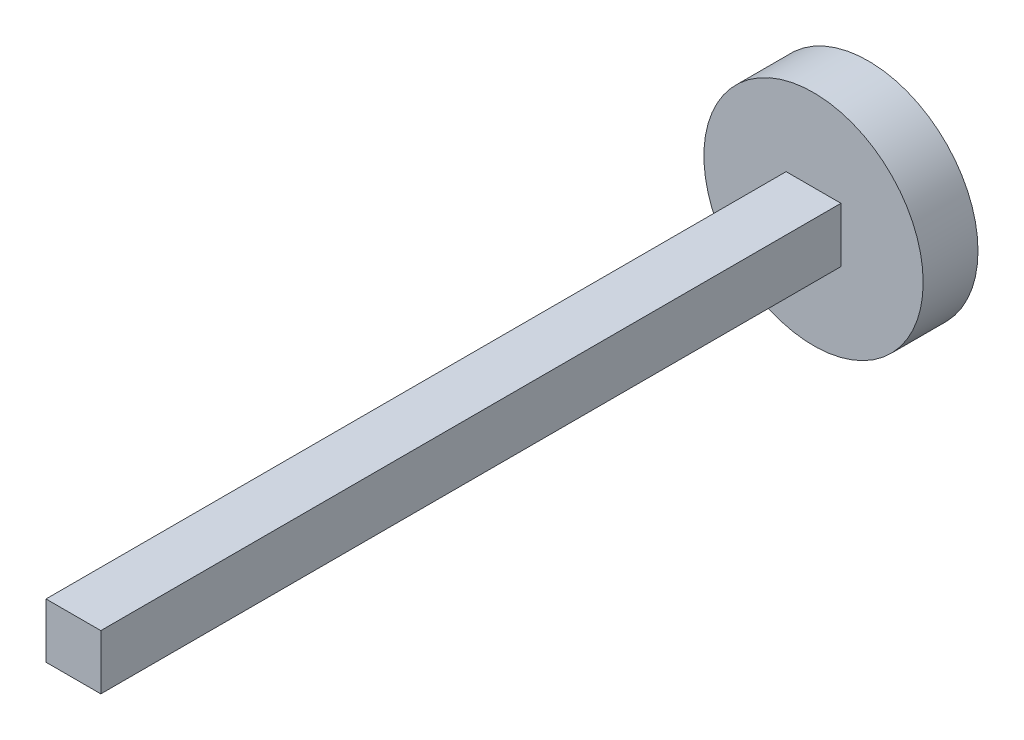
ISO-10303-21;
HEADER;
FILE_DESCRIPTION(('STEP AP214'),'2;1');
FILE_NAME('part.step','',(''),(''),'','','');
FILE_SCHEMA(('AUTOMOTIVE_DESIGN { 1 0 10303 214 1 1 1 1 }'));
ENDSEC;
DATA;
#1=APPLICATION_CONTEXT('core data for automotive mechanical design processes');
#2=APPLICATION_PROTOCOL_DEFINITION('international standard','automotive_design',2000,#1);
#3=PRODUCT_CONTEXT('',#1,'mechanical');
#4=PRODUCT('Part','Part','',(#3));
#5=PRODUCT_RELATED_PRODUCT_CATEGORY('part','',(#4));
#6=PRODUCT_DEFINITION_FORMATION('','',#4);
#7=PRODUCT_DEFINITION_CONTEXT('part definition',#1,'design');
#8=PRODUCT_DEFINITION('design','',#6,#7);
#9=PRODUCT_DEFINITION_SHAPE('','',#8);
#10=(LENGTH_UNIT() NAMED_UNIT(*) SI_UNIT(.MILLI.,.METRE.));
#11=(NAMED_UNIT(*) PLANE_ANGLE_UNIT() SI_UNIT($,.RADIAN.));
#12=(NAMED_UNIT(*) SI_UNIT($,.STERADIAN.) SOLID_ANGLE_UNIT());
#13=UNCERTAINTY_MEASURE_WITH_UNIT(LENGTH_MEASURE(1.E-05),#10,'distance_accuracy_value','');
#14=(GEOMETRIC_REPRESENTATION_CONTEXT(3) GLOBAL_UNCERTAINTY_ASSIGNED_CONTEXT((#13)) GLOBAL_UNIT_ASSIGNED_CONTEXT((#10,
#11,#12)) REPRESENTATION_CONTEXT('',''));
#15=CARTESIAN_POINT('',(0.,0.,0.));
#16=DIRECTION('',(0.,0.,1.));
#17=DIRECTION('',(1.,0.,0.));
#18=AXIS2_PLACEMENT_3D('',#15,#16,#17);
#19=CARTESIAN_POINT('',(0.,0.,20.));
#20=DIRECTION('',(0.,0.,-1.));
#21=DIRECTION('',(-1.,0.,0.));
#22=AXIS2_PLACEMENT_3D('',#19,#20,#21);
#23=CYLINDRICAL_SURFACE('',#22,40.);
#24=CARTESIAN_POINT('',(0.,0.,20.));
#25=DIRECTION('',(0.,0.,1.));
#26=DIRECTION('',(1.,0.,0.));
#27=AXIS2_PLACEMENT_3D('',#24,#25,#26);
#28=CIRCLE('',#27,40.);
#29=CARTESIAN_POINT('',(40.,0.,20.));
#30=VERTEX_POINT('',#29);
#31=EDGE_CURVE('E11',#30,#30,#28,.T.);
#32=ORIENTED_EDGE('',*,*,#31,.F.);
#33=EDGE_LOOP('',(#32));
#34=FACE_BOUND('',#33,.T.);
#35=CARTESIAN_POINT('',(0.,0.,0.));
#36=DIRECTION('',(0.,0.,1.));
#37=DIRECTION('',(1.,0.,0.));
#38=AXIS2_PLACEMENT_3D('',#35,#36,#37);
#39=CIRCLE('',#38,40.);
#40=CARTESIAN_POINT('',(40.,0.,0.));
#41=VERTEX_POINT('',#40);
#42=EDGE_CURVE('E42',#41,#41,#39,.T.);
#43=ORIENTED_EDGE('',*,*,#42,.T.);
#44=EDGE_LOOP('',(#43));
#45=FACE_BOUND('',#44,.T.);
#46=ADVANCED_FACE('F39',(#34,#45),#23,.T.);
#47=CARTESIAN_POINT('',(0.,0.,20.));
#48=DIRECTION('',(0.,0.,1.));
#49=DIRECTION('',(1.,0.,0.));
#50=AXIS2_PLACEMENT_3D('',#47,#48,#49);
#51=PLANE('',#50);
#52=DIRECTION('',(0.,1.,0.));
#53=VECTOR('',#52,1.);
#54=CARTESIAN_POINT('',(10.,-10.,20.));
#55=LINE('',#54,#53);
#56=CARTESIAN_POINT('',(10.,-10.,20.));
#57=VERTEX_POINT('',#56);
#58=CARTESIAN_POINT('',(10.,10.,20.));
#59=VERTEX_POINT('',#58);
#60=EDGE_CURVE('E54',#57,#59,#55,.T.);
#61=ORIENTED_EDGE('',*,*,#60,.F.);
#62=DIRECTION('',(1.,0.,0.));
#63=VECTOR('',#62,1.);
#64=CARTESIAN_POINT('',(-10.,-10.,20.));
#65=LINE('',#64,#63);
#66=CARTESIAN_POINT('',(-10.,-10.,20.));
#67=VERTEX_POINT('',#66);
#68=EDGE_CURVE('E58',#67,#57,#65,.T.);
#69=ORIENTED_EDGE('',*,*,#68,.F.);
#70=DIRECTION('',(0.,-1.,0.));
#71=VECTOR('',#70,1.);
#72=CARTESIAN_POINT('',(-10.,-10.,20.));
#73=LINE('',#72,#71);
#74=CARTESIAN_POINT('',(-10.,10.,20.));
#75=VERTEX_POINT('',#74);
#76=EDGE_CURVE('E118',#75,#67,#73,.T.);
#77=ORIENTED_EDGE('',*,*,#76,.F.);
#78=DIRECTION('',(-1.,0.,0.));
#79=VECTOR('',#78,1.);
#80=CARTESIAN_POINT('',(-10.,10.,20.));
#81=LINE('',#80,#79);
#82=EDGE_CURVE('E121',#59,#75,#81,.T.);
#83=ORIENTED_EDGE('',*,*,#82,.F.);
#84=EDGE_LOOP('',(#61,#69,#77,#83));
#85=FACE_BOUND('',#84,.T.);
#86=ORIENTED_EDGE('',*,*,#31,.T.);
#87=EDGE_LOOP('',(#86));
#88=FACE_BOUND('',#87,.T.);
#89=ADVANCED_FACE('F143',(#85,#88),#51,.T.);
#90=CARTESIAN_POINT('',(0.,0.,0.));
#91=DIRECTION('',(0.,0.,1.));
#92=DIRECTION('',(1.,0.,0.));
#93=AXIS2_PLACEMENT_3D('',#90,#91,#92);
#94=PLANE('',#93);
#95=ORIENTED_EDGE('',*,*,#42,.F.);
#96=EDGE_LOOP('',(#95));
#97=FACE_BOUND('',#96,.T.);
#98=ADVANCED_FACE('F148',(#97),#94,.F.);
#99=CARTESIAN_POINT('',(10.,-10.,290.));
#100=DIRECTION('',(-1.,0.,0.));
#101=DIRECTION('',(0.,0.,1.));
#102=AXIS2_PLACEMENT_3D('',#99,#100,#101);
#103=PLANE('',#102);
#104=ORIENTED_EDGE('',*,*,#60,.T.);
#105=DIRECTION('',(0.,0.,-1.));
#106=VECTOR('',#105,1.);
#107=CARTESIAN_POINT('',(10.,10.,290.));
#108=LINE('',#107,#106);
#109=CARTESIAN_POINT('',(10.,10.,290.));
#110=VERTEX_POINT('',#109);
#111=EDGE_CURVE('E83',#110,#59,#108,.T.);
#112=ORIENTED_EDGE('',*,*,#111,.F.);
#113=DIRECTION('',(0.,1.,0.));
#114=VECTOR('',#113,1.);
#115=CARTESIAN_POINT('',(10.,-10.,290.));
#116=LINE('',#115,#114);
#117=CARTESIAN_POINT('',(10.,-10.,290.));
#118=VERTEX_POINT('',#117);
#119=EDGE_CURVE('E90',#118,#110,#116,.T.);
#120=ORIENTED_EDGE('',*,*,#119,.F.);
#121=DIRECTION('',(0.,0.,-1.));
#122=VECTOR('',#121,1.);
#123=CARTESIAN_POINT('',(10.,-10.,290.));
#124=LINE('',#123,#122);
#125=EDGE_CURVE('E113',#118,#57,#124,.T.);
#126=ORIENTED_EDGE('',*,*,#125,.T.);
#127=EDGE_LOOP('',(#104,#112,#120,#126));
#128=FACE_BOUND('',#127,.T.);
#129=ADVANCED_FACE('F101',(#128),#103,.F.);
#130=CARTESIAN_POINT('',(-10.,10.,290.));
#131=DIRECTION('',(0.,-1.,0.));
#132=DIRECTION('',(0.,0.,-1.));
#133=AXIS2_PLACEMENT_3D('',#130,#131,#132);
#134=PLANE('',#133);
#135=ORIENTED_EDGE('',*,*,#82,.T.);
#136=DIRECTION('',(0.,0.,-1.));
#137=VECTOR('',#136,1.);
#138=CARTESIAN_POINT('',(-10.,10.,290.));
#139=LINE('',#138,#137);
#140=CARTESIAN_POINT('',(-10.,10.,290.));
#141=VERTEX_POINT('',#140);
#142=EDGE_CURVE('E85',#141,#75,#139,.T.);
#143=ORIENTED_EDGE('',*,*,#142,.F.);
#144=DIRECTION('',(-1.,0.,0.));
#145=VECTOR('',#144,1.);
#146=CARTESIAN_POINT('',(-10.,10.,290.));
#147=LINE('',#146,#145);
#148=EDGE_CURVE('E78',#110,#141,#147,.T.);
#149=ORIENTED_EDGE('',*,*,#148,.F.);
#150=ORIENTED_EDGE('',*,*,#111,.T.);
#151=EDGE_LOOP('',(#135,#143,#149,#150));
#152=FACE_BOUND('',#151,.T.);
#153=ADVANCED_FACE('F81',(#152),#134,.F.);
#154=CARTESIAN_POINT('',(-10.,-10.,290.));
#155=DIRECTION('',(1.,0.,0.));
#156=DIRECTION('',(0.,0.,-1.));
#157=AXIS2_PLACEMENT_3D('',#154,#155,#156);
#158=PLANE('',#157);
#159=ORIENTED_EDGE('',*,*,#76,.T.);
#160=DIRECTION('',(0.,0.,-1.));
#161=VECTOR('',#160,1.);
#162=CARTESIAN_POINT('',(-10.,-10.,290.));
#163=LINE('',#162,#161);
#164=CARTESIAN_POINT('',(-10.,-10.,290.));
#165=VERTEX_POINT('',#164);
#166=EDGE_CURVE('E107',#165,#67,#163,.T.);
#167=ORIENTED_EDGE('',*,*,#166,.F.);
#168=DIRECTION('',(0.,-1.,0.));
#169=VECTOR('',#168,1.);
#170=CARTESIAN_POINT('',(-10.,-10.,290.));
#171=LINE('',#170,#169);
#172=EDGE_CURVE('E89',#141,#165,#171,.T.);
#173=ORIENTED_EDGE('',*,*,#172,.F.);
#174=ORIENTED_EDGE('',*,*,#142,.T.);
#175=EDGE_LOOP('',(#159,#167,#173,#174));
#176=FACE_BOUND('',#175,.T.);
#177=ADVANCED_FACE('F131',(#176),#158,.F.);
#178=CARTESIAN_POINT('',(-10.,-10.,290.));
#179=DIRECTION('',(0.,1.,0.));
#180=DIRECTION('',(0.,0.,1.));
#181=AXIS2_PLACEMENT_3D('',#178,#179,#180);
#182=PLANE('',#181);
#183=ORIENTED_EDGE('',*,*,#68,.T.);
#184=ORIENTED_EDGE('',*,*,#125,.F.);
#185=DIRECTION('',(1.,0.,0.));
#186=VECTOR('',#185,1.);
#187=CARTESIAN_POINT('',(-10.,-10.,290.));
#188=LINE('',#187,#186);
#189=EDGE_CURVE('E95',#165,#118,#188,.T.);
#190=ORIENTED_EDGE('',*,*,#189,.F.);
#191=ORIENTED_EDGE('',*,*,#166,.T.);
#192=EDGE_LOOP('',(#183,#184,#190,#191));
#193=FACE_BOUND('',#192,.T.);
#194=ADVANCED_FACE('F133',(#193),#182,.F.);
#195=CARTESIAN_POINT('',(0.,0.,290.));
#196=DIRECTION('',(0.,0.,-1.));
#197=DIRECTION('',(-1.,0.,0.));
#198=AXIS2_PLACEMENT_3D('',#195,#196,#197);
#199=PLANE('',#198);
#200=ORIENTED_EDGE('',*,*,#119,.T.);
#201=ORIENTED_EDGE('',*,*,#148,.T.);
#202=ORIENTED_EDGE('',*,*,#172,.T.);
#203=ORIENTED_EDGE('',*,*,#189,.T.);
#204=EDGE_LOOP('',(#200,#201,#202,#203));
#205=FACE_BOUND('',#204,.T.);
#206=ADVANCED_FACE('F93',(#205),#199,.F.);
#207=CLOSED_SHELL('',(#46,#89,#98,#129,#153,#177,#194,#206));
#208=MANIFOLD_SOLID_BREP('B2',#207);
#209=ADVANCED_BREP_SHAPE_REPRESENTATION('',(#18,#208),#14);
#210=SHAPE_DEFINITION_REPRESENTATION(#9,#209);
ENDSEC;
END-ISO-10303-21;
